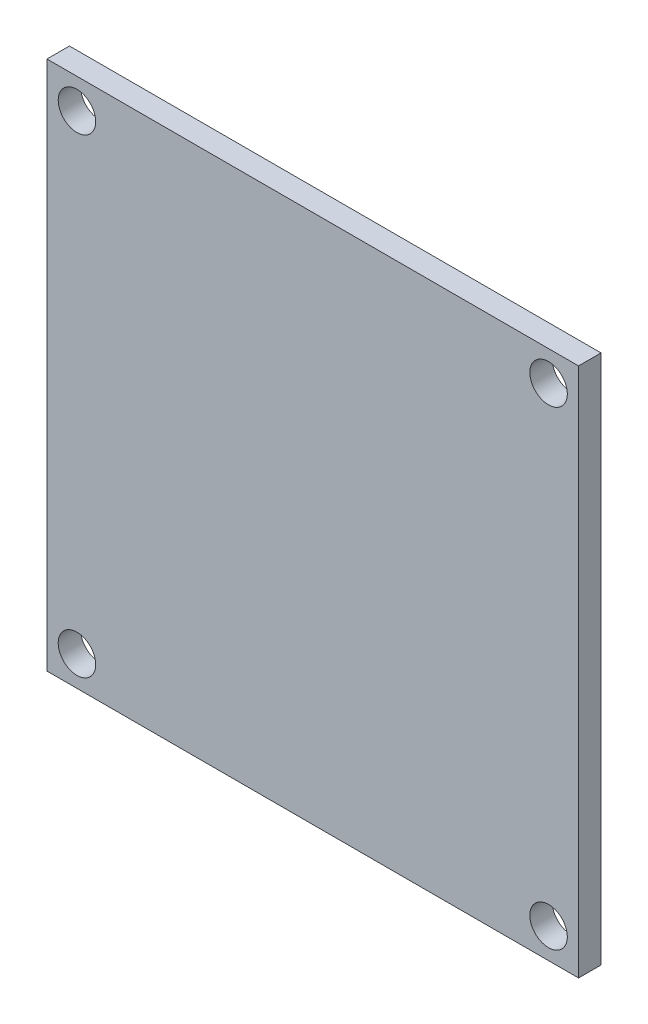
ISO-10303-21;
HEADER;
FILE_DESCRIPTION(('STEP AP214'),'2;1');
FILE_NAME('part.step','',(''),(''),'','','');
FILE_SCHEMA(('AUTOMOTIVE_DESIGN { 1 0 10303 214 1 1 1 1 }'));
ENDSEC;
DATA;
#1=APPLICATION_CONTEXT('core data for automotive mechanical design processes');
#2=APPLICATION_PROTOCOL_DEFINITION('international standard','automotive_design',2000,#1);
#3=PRODUCT_CONTEXT('',#1,'mechanical');
#4=PRODUCT('Part','Part','',(#3));
#5=PRODUCT_RELATED_PRODUCT_CATEGORY('part','',(#4));
#6=PRODUCT_DEFINITION_FORMATION('','',#4);
#7=PRODUCT_DEFINITION_CONTEXT('part definition',#1,'design');
#8=PRODUCT_DEFINITION('design','',#6,#7);
#9=PRODUCT_DEFINITION_SHAPE('','',#8);
#10=(LENGTH_UNIT() NAMED_UNIT(*) SI_UNIT(.MILLI.,.METRE.));
#11=(NAMED_UNIT(*) PLANE_ANGLE_UNIT() SI_UNIT($,.RADIAN.));
#12=(NAMED_UNIT(*) SI_UNIT($,.STERADIAN.) SOLID_ANGLE_UNIT());
#13=UNCERTAINTY_MEASURE_WITH_UNIT(LENGTH_MEASURE(1.E-05),#10,'distance_accuracy_value','');
#14=(GEOMETRIC_REPRESENTATION_CONTEXT(3) GLOBAL_UNCERTAINTY_ASSIGNED_CONTEXT((#13)) GLOBAL_UNIT_ASSIGNED_CONTEXT((#10,
#11,#12)) REPRESENTATION_CONTEXT('',''));
#15=CARTESIAN_POINT('',(0.,0.,0.));
#16=DIRECTION('',(0.,0.,1.));
#17=DIRECTION('',(1.,0.,0.));
#18=AXIS2_PLACEMENT_3D('',#15,#16,#17);
#19=CARTESIAN_POINT('',(-35.45,35.35,3.));
#20=DIRECTION('',(1.,0.,0.));
#21=DIRECTION('',(0.,0.,-1.));
#22=AXIS2_PLACEMENT_3D('',#19,#20,#21);
#23=PLANE('',#22);
#24=DIRECTION('',(0.,-1.,0.));
#25=VECTOR('',#24,1.);
#26=CARTESIAN_POINT('',(-35.45,35.35,0.));
#27=LINE('',#26,#25);
#28=CARTESIAN_POINT('',(-35.45,35.35,0.));
#29=VERTEX_POINT('',#28);
#30=CARTESIAN_POINT('',(-35.45,-35.35,0.));
#31=VERTEX_POINT('',#30);
#32=EDGE_CURVE('E101',#29,#31,#27,.T.);
#33=ORIENTED_EDGE('',*,*,#32,.T.);
#34=DIRECTION('',(0.,0.,-1.));
#35=VECTOR('',#34,1.);
#36=CARTESIAN_POINT('',(-35.45,-35.35,3.));
#37=LINE('',#36,#35);
#38=CARTESIAN_POINT('',(-35.45,-35.35,3.));
#39=VERTEX_POINT('',#38);
#40=EDGE_CURVE('E11',#39,#31,#37,.T.);
#41=ORIENTED_EDGE('',*,*,#40,.F.);
#42=DIRECTION('',(0.,-1.,0.));
#43=VECTOR('',#42,1.);
#44=CARTESIAN_POINT('',(-35.45,35.35,3.));
#45=LINE('',#44,#43);
#46=CARTESIAN_POINT('',(-35.45,35.35,3.));
#47=VERTEX_POINT('',#46);
#48=EDGE_CURVE('E89',#47,#39,#45,.T.);
#49=ORIENTED_EDGE('',*,*,#48,.F.);
#50=DIRECTION('',(0.,0.,-1.));
#51=VECTOR('',#50,1.);
#52=CARTESIAN_POINT('',(-35.45,35.35,3.));
#53=LINE('',#52,#51);
#54=EDGE_CURVE('E97',#47,#29,#53,.T.);
#55=ORIENTED_EDGE('',*,*,#54,.T.);
#56=EDGE_LOOP('',(#33,#41,#49,#55));
#57=FACE_BOUND('',#56,.T.);
#58=ADVANCED_FACE('F38',(#57),#23,.F.);
#59=CARTESIAN_POINT('',(-35.45,-35.35,3.));
#60=DIRECTION('',(0.,1.,0.));
#61=DIRECTION('',(0.,0.,1.));
#62=AXIS2_PLACEMENT_3D('',#59,#60,#61);
#63=PLANE('',#62);
#64=DIRECTION('',(1.,0.,0.));
#65=VECTOR('',#64,1.);
#66=CARTESIAN_POINT('',(-35.45,-35.35,0.));
#67=LINE('',#66,#65);
#68=CARTESIAN_POINT('',(35.45,-35.35,0.));
#69=VERTEX_POINT('',#68);
#70=EDGE_CURVE('E93',#31,#69,#67,.T.);
#71=ORIENTED_EDGE('',*,*,#70,.T.);
#72=DIRECTION('',(0.,0.,-1.));
#73=VECTOR('',#72,1.);
#74=CARTESIAN_POINT('',(35.45,-35.35,3.));
#75=LINE('',#74,#73);
#76=CARTESIAN_POINT('',(35.45,-35.35,3.));
#77=VERTEX_POINT('',#76);
#78=EDGE_CURVE('E46',#77,#69,#75,.T.);
#79=ORIENTED_EDGE('',*,*,#78,.F.);
#80=DIRECTION('',(1.,0.,0.));
#81=VECTOR('',#80,1.);
#82=CARTESIAN_POINT('',(-35.45,-35.35,3.));
#83=LINE('',#82,#81);
#84=EDGE_CURVE('E84',#39,#77,#83,.T.);
#85=ORIENTED_EDGE('',*,*,#84,.F.);
#86=ORIENTED_EDGE('',*,*,#40,.T.);
#87=EDGE_LOOP('',(#71,#79,#85,#86));
#88=FACE_BOUND('',#87,.T.);
#89=ADVANCED_FACE('F92',(#88),#63,.F.);
#90=CARTESIAN_POINT('',(35.45,35.35,3.));
#91=DIRECTION('',(-1.,0.,0.));
#92=DIRECTION('',(0.,-1.,0.));
#93=AXIS2_PLACEMENT_3D('',#90,#91,#92);
#94=PLANE('',#93);
#95=DIRECTION('',(0.,1.,0.));
#96=VECTOR('',#95,1.);
#97=CARTESIAN_POINT('',(35.45,35.35,0.));
#98=LINE('',#97,#96);
#99=CARTESIAN_POINT('',(35.45,35.35,0.));
#100=VERTEX_POINT('',#99);
#101=EDGE_CURVE('E71',#69,#100,#98,.T.);
#102=ORIENTED_EDGE('',*,*,#101,.T.);
#103=DIRECTION('',(0.,0.,-1.));
#104=VECTOR('',#103,1.);
#105=CARTESIAN_POINT('',(35.45,35.35,3.));
#106=LINE('',#105,#104);
#107=CARTESIAN_POINT('',(35.45,35.35,3.));
#108=VERTEX_POINT('',#107);
#109=EDGE_CURVE('E94',#108,#100,#106,.T.);
#110=ORIENTED_EDGE('',*,*,#109,.F.);
#111=DIRECTION('',(0.,1.,0.));
#112=VECTOR('',#111,1.);
#113=CARTESIAN_POINT('',(35.45,35.35,3.));
#114=LINE('',#113,#112);
#115=EDGE_CURVE('E87',#77,#108,#114,.T.);
#116=ORIENTED_EDGE('',*,*,#115,.F.);
#117=ORIENTED_EDGE('',*,*,#78,.T.);
#118=EDGE_LOOP('',(#102,#110,#116,#117));
#119=FACE_BOUND('',#118,.T.);
#120=ADVANCED_FACE('F95',(#119),#94,.F.);
#121=CARTESIAN_POINT('',(-35.45,35.35,3.));
#122=DIRECTION('',(0.,-1.,0.));
#123=DIRECTION('',(0.,0.,-1.));
#124=AXIS2_PLACEMENT_3D('',#121,#122,#123);
#125=PLANE('',#124);
#126=DIRECTION('',(-1.,0.,0.));
#127=VECTOR('',#126,1.);
#128=CARTESIAN_POINT('',(-35.45,35.35,0.));
#129=LINE('',#128,#127);
#130=EDGE_CURVE('E77',#100,#29,#129,.T.);
#131=ORIENTED_EDGE('',*,*,#130,.T.);
#132=ORIENTED_EDGE('',*,*,#54,.F.);
#133=DIRECTION('',(-1.,0.,0.));
#134=VECTOR('',#133,1.);
#135=CARTESIAN_POINT('',(-35.45,35.35,3.));
#136=LINE('',#135,#134);
#137=EDGE_CURVE('E54',#108,#47,#136,.T.);
#138=ORIENTED_EDGE('',*,*,#137,.F.);
#139=ORIENTED_EDGE('',*,*,#109,.T.);
#140=EDGE_LOOP('',(#131,#132,#138,#139));
#141=FACE_BOUND('',#140,.T.);
#142=ADVANCED_FACE('F109',(#141),#125,.F.);
#143=CARTESIAN_POINT('',(0.,0.,3.));
#144=DIRECTION('',(0.,0.,1.));
#145=DIRECTION('',(1.,0.,0.));
#146=AXIS2_PLACEMENT_3D('',#143,#144,#145);
#147=PLANE('',#146);
#148=CARTESIAN_POINT('',(-31.45,31.35,3.));
#149=DIRECTION('',(0.,0.,-1.));
#150=DIRECTION('',(-1.,0.,0.));
#151=AXIS2_PLACEMENT_3D('',#148,#149,#150);
#152=CIRCLE('',#151,2.5);
#153=CARTESIAN_POINT('',(-33.95,31.35,3.));
#154=VERTEX_POINT('',#153);
#155=EDGE_CURVE('E124',#154,#154,#152,.T.);
#156=ORIENTED_EDGE('',*,*,#155,.T.);
#157=EDGE_LOOP('',(#156));
#158=FACE_BOUND('',#157,.T.);
#159=CARTESIAN_POINT('',(-31.45,-31.35,3.));
#160=DIRECTION('',(0.,0.,-1.));
#161=DIRECTION('',(-1.,0.,0.));
#162=AXIS2_PLACEMENT_3D('',#159,#160,#161);
#163=CIRCLE('',#162,2.50000000000001);
#164=CARTESIAN_POINT('',(-33.95,-31.35,3.));
#165=VERTEX_POINT('',#164);
#166=EDGE_CURVE('E130',#165,#165,#163,.T.);
#167=ORIENTED_EDGE('',*,*,#166,.T.);
#168=EDGE_LOOP('',(#167));
#169=FACE_BOUND('',#168,.T.);
#170=CARTESIAN_POINT('',(31.45,-31.35,3.));
#171=DIRECTION('',(0.,0.,-1.));
#172=DIRECTION('',(-1.,0.,0.));
#173=AXIS2_PLACEMENT_3D('',#170,#171,#172);
#174=CIRCLE('',#173,2.5);
#175=CARTESIAN_POINT('',(28.95,-31.35,3.));
#176=VERTEX_POINT('',#175);
#177=EDGE_CURVE('E118',#176,#176,#174,.T.);
#178=ORIENTED_EDGE('',*,*,#177,.T.);
#179=EDGE_LOOP('',(#178));
#180=FACE_BOUND('',#179,.T.);
#181=CARTESIAN_POINT('',(31.45,31.35,3.));
#182=DIRECTION('',(0.,0.,-1.));
#183=DIRECTION('',(-1.,0.,0.));
#184=AXIS2_PLACEMENT_3D('',#181,#182,#183);
#185=CIRCLE('',#184,2.5);
#186=CARTESIAN_POINT('',(28.95,31.35,3.));
#187=VERTEX_POINT('',#186);
#188=EDGE_CURVE('E104',#187,#187,#185,.T.);
#189=ORIENTED_EDGE('',*,*,#188,.T.);
#190=EDGE_LOOP('',(#189));
#191=FACE_BOUND('',#190,.T.);
#192=ORIENTED_EDGE('',*,*,#48,.T.);
#193=ORIENTED_EDGE('',*,*,#84,.T.);
#194=ORIENTED_EDGE('',*,*,#115,.T.);
#195=ORIENTED_EDGE('',*,*,#137,.T.);
#196=EDGE_LOOP('',(#192,#193,#194,#195));
#197=FACE_BOUND('',#196,.T.);
#198=ADVANCED_FACE('F85',(#158,#169,#180,#191,#197),#147,.T.);
#199=CARTESIAN_POINT('',(0.,0.,0.));
#200=DIRECTION('',(0.,0.,1.));
#201=DIRECTION('',(1.,0.,0.));
#202=AXIS2_PLACEMENT_3D('',#199,#200,#201);
#203=PLANE('',#202);
#204=CARTESIAN_POINT('',(-31.45,31.35,0.));
#205=DIRECTION('',(0.,0.,-1.));
#206=DIRECTION('',(-1.,0.,0.));
#207=AXIS2_PLACEMENT_3D('',#204,#205,#206);
#208=CIRCLE('',#207,2.5);
#209=CARTESIAN_POINT('',(-33.95,31.35,0.));
#210=VERTEX_POINT('',#209);
#211=EDGE_CURVE('E121',#210,#210,#208,.T.);
#212=ORIENTED_EDGE('',*,*,#211,.F.);
#213=EDGE_LOOP('',(#212));
#214=FACE_BOUND('',#213,.T.);
#215=CARTESIAN_POINT('',(-31.45,-31.35,0.));
#216=DIRECTION('',(0.,0.,-1.));
#217=DIRECTION('',(-1.,0.,0.));
#218=AXIS2_PLACEMENT_3D('',#215,#216,#217);
#219=CIRCLE('',#218,2.50000000000001);
#220=CARTESIAN_POINT('',(-33.95,-31.35,0.));
#221=VERTEX_POINT('',#220);
#222=EDGE_CURVE('E127',#221,#221,#219,.T.);
#223=ORIENTED_EDGE('',*,*,#222,.F.);
#224=EDGE_LOOP('',(#223));
#225=FACE_BOUND('',#224,.T.);
#226=CARTESIAN_POINT('',(31.45,-31.35,0.));
#227=DIRECTION('',(0.,0.,-1.));
#228=DIRECTION('',(-1.,0.,0.));
#229=AXIS2_PLACEMENT_3D('',#226,#227,#228);
#230=CIRCLE('',#229,2.5);
#231=CARTESIAN_POINT('',(28.95,-31.35,0.));
#232=VERTEX_POINT('',#231);
#233=EDGE_CURVE('E133',#232,#232,#230,.T.);
#234=ORIENTED_EDGE('',*,*,#233,.F.);
#235=EDGE_LOOP('',(#234));
#236=FACE_BOUND('',#235,.T.);
#237=CARTESIAN_POINT('',(31.45,31.35,0.));
#238=DIRECTION('',(0.,0.,-1.));
#239=DIRECTION('',(-1.,0.,0.));
#240=AXIS2_PLACEMENT_3D('',#237,#238,#239);
#241=CIRCLE('',#240,2.5);
#242=CARTESIAN_POINT('',(28.95,31.35,0.));
#243=VERTEX_POINT('',#242);
#244=EDGE_CURVE('E115',#243,#243,#241,.T.);
#245=ORIENTED_EDGE('',*,*,#244,.F.);
#246=EDGE_LOOP('',(#245));
#247=FACE_BOUND('',#246,.T.);
#248=ORIENTED_EDGE('',*,*,#32,.F.);
#249=ORIENTED_EDGE('',*,*,#130,.F.);
#250=ORIENTED_EDGE('',*,*,#101,.F.);
#251=ORIENTED_EDGE('',*,*,#70,.F.);
#252=EDGE_LOOP('',(#248,#249,#250,#251));
#253=FACE_BOUND('',#252,.T.);
#254=ADVANCED_FACE('F112',(#214,#225,#236,#247,#253),#203,.F.);
#255=CARTESIAN_POINT('',(31.45,31.35,3.));
#256=DIRECTION('',(0.,0.,-1.));
#257=DIRECTION('',(-1.,0.,0.));
#258=AXIS2_PLACEMENT_3D('',#255,#256,#257);
#259=CYLINDRICAL_SURFACE('',#258,2.5);
#260=ORIENTED_EDGE('',*,*,#188,.F.);
#261=EDGE_LOOP('',(#260));
#262=FACE_BOUND('',#261,.T.);
#263=ORIENTED_EDGE('',*,*,#244,.T.);
#264=EDGE_LOOP('',(#263));
#265=FACE_BOUND('',#264,.T.);
#266=ADVANCED_FACE('F145',(#262,#265),#259,.F.);
#267=CARTESIAN_POINT('',(31.45,-31.35,3.));
#268=DIRECTION('',(0.,0.,-1.));
#269=DIRECTION('',(-1.,0.,0.));
#270=AXIS2_PLACEMENT_3D('',#267,#268,#269);
#271=CYLINDRICAL_SURFACE('',#270,2.5);
#272=ORIENTED_EDGE('',*,*,#177,.F.);
#273=EDGE_LOOP('',(#272));
#274=FACE_BOUND('',#273,.T.);
#275=ORIENTED_EDGE('',*,*,#233,.T.);
#276=EDGE_LOOP('',(#275));
#277=FACE_BOUND('',#276,.T.);
#278=ADVANCED_FACE('F141',(#274,#277),#271,.F.);
#279=CARTESIAN_POINT('',(-31.45,-31.35,3.));
#280=DIRECTION('',(0.,0.,-1.));
#281=DIRECTION('',(-1.,0.,0.));
#282=AXIS2_PLACEMENT_3D('',#279,#280,#281);
#283=CYLINDRICAL_SURFACE('',#282,2.50000000000001);
#284=ORIENTED_EDGE('',*,*,#166,.F.);
#285=EDGE_LOOP('',(#284));
#286=FACE_BOUND('',#285,.T.);
#287=ORIENTED_EDGE('',*,*,#222,.T.);
#288=EDGE_LOOP('',(#287));
#289=FACE_BOUND('',#288,.T.);
#290=ADVANCED_FACE('F144',(#286,#289),#283,.F.);
#291=CARTESIAN_POINT('',(-31.45,31.35,3.));
#292=DIRECTION('',(0.,0.,-1.));
#293=DIRECTION('',(-1.,0.,0.));
#294=AXIS2_PLACEMENT_3D('',#291,#292,#293);
#295=CYLINDRICAL_SURFACE('',#294,2.5);
#296=ORIENTED_EDGE('',*,*,#155,.F.);
#297=EDGE_LOOP('',(#296));
#298=FACE_BOUND('',#297,.T.);
#299=ORIENTED_EDGE('',*,*,#211,.T.);
#300=EDGE_LOOP('',(#299));
#301=FACE_BOUND('',#300,.T.);
#302=ADVANCED_FACE('F183',(#298,#301),#295,.F.);
#303=CLOSED_SHELL('',(#58,#89,#120,#142,#198,#254,#266,#278,#290,#302));
#304=MANIFOLD_SOLID_BREP('B2',#303);
#305=ADVANCED_BREP_SHAPE_REPRESENTATION('',(#18,#304),#14);
#306=SHAPE_DEFINITION_REPRESENTATION(#9,#305);
ENDSEC;
END-ISO-10303-21;
